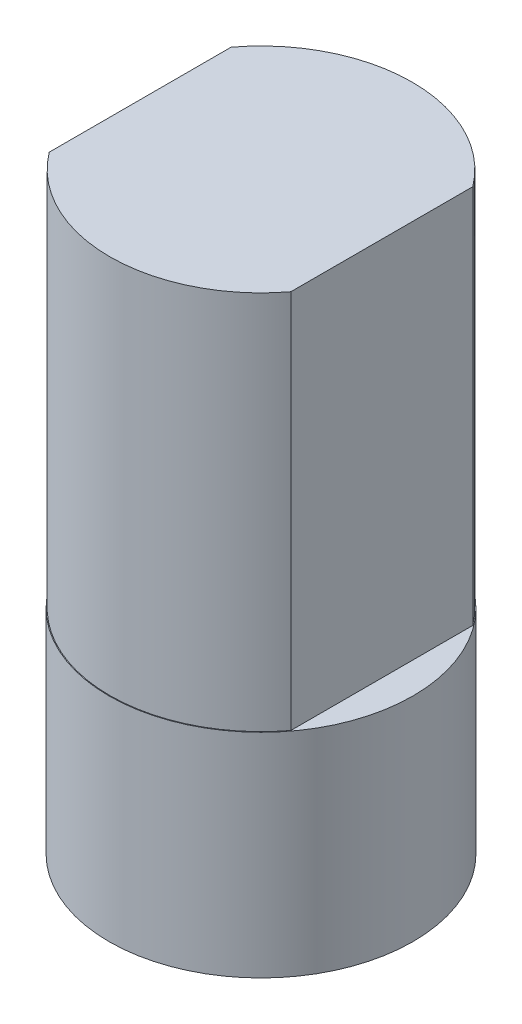
ISO-10303-21;
HEADER;
FILE_DESCRIPTION(('STEP AP214'),'2;1');
FILE_NAME('part.step','',(''),(''),'','','');
FILE_SCHEMA(('AUTOMOTIVE_DESIGN { 1 0 10303 214 1 1 1 1 }'));
ENDSEC;
DATA;
#1=APPLICATION_CONTEXT('core data for automotive mechanical design processes');
#2=APPLICATION_PROTOCOL_DEFINITION('international standard','automotive_design',2000,#1);
#3=PRODUCT_CONTEXT('',#1,'mechanical');
#4=PRODUCT('Part','Part','',(#3));
#5=PRODUCT_RELATED_PRODUCT_CATEGORY('part','',(#4));
#6=PRODUCT_DEFINITION_FORMATION('','',#4);
#7=PRODUCT_DEFINITION_CONTEXT('part definition',#1,'design');
#8=PRODUCT_DEFINITION('design','',#6,#7);
#9=PRODUCT_DEFINITION_SHAPE('','',#8);
#10=(LENGTH_UNIT() NAMED_UNIT(*) SI_UNIT(.MILLI.,.METRE.));
#11=(NAMED_UNIT(*) PLANE_ANGLE_UNIT() SI_UNIT($,.RADIAN.));
#12=(NAMED_UNIT(*) SI_UNIT($,.STERADIAN.) SOLID_ANGLE_UNIT());
#13=UNCERTAINTY_MEASURE_WITH_UNIT(LENGTH_MEASURE(1.E-05),#10,'distance_accuracy_value','');
#14=(GEOMETRIC_REPRESENTATION_CONTEXT(3) GLOBAL_UNCERTAINTY_ASSIGNED_CONTEXT((#13)) GLOBAL_UNIT_ASSIGNED_CONTEXT((#10,
#11,#12)) REPRESENTATION_CONTEXT('',''));
#15=CARTESIAN_POINT('',(0.,0.,0.));
#16=DIRECTION('',(0.,0.,1.));
#17=DIRECTION('',(1.,0.,0.));
#18=AXIS2_PLACEMENT_3D('',#15,#16,#17);
#19=CARTESIAN_POINT('',(0.,7.,0.));
#20=DIRECTION('',(0.,-1.,0.));
#21=DIRECTION('',(0.,0.,-1.));
#22=AXIS2_PLACEMENT_3D('',#19,#20,#21);
#23=CYLINDRICAL_SURFACE('',#22,5.);
#24=CARTESIAN_POINT('',(0.,7.,0.));
#25=DIRECTION('',(0.,1.,0.));
#26=DIRECTION('',(0.,0.,1.));
#27=AXIS2_PLACEMENT_3D('',#24,#25,#26);
#28=CIRCLE('',#27,5.);
#29=CARTESIAN_POINT('',(0.,7.,5.));
#30=VERTEX_POINT('',#29);
#31=EDGE_CURVE('E11',#30,#30,#28,.T.);
#32=ORIENTED_EDGE('',*,*,#31,.F.);
#33=EDGE_LOOP('',(#32));
#34=FACE_BOUND('',#33,.T.);
#35=CARTESIAN_POINT('',(0.,0.,0.));
#36=DIRECTION('',(0.,1.,0.));
#37=DIRECTION('',(0.,0.,1.));
#38=AXIS2_PLACEMENT_3D('',#35,#36,#37);
#39=CIRCLE('',#38,5.);
#40=CARTESIAN_POINT('',(0.,0.,5.));
#41=VERTEX_POINT('',#40);
#42=EDGE_CURVE('E42',#41,#41,#39,.T.);
#43=ORIENTED_EDGE('',*,*,#42,.T.);
#44=EDGE_LOOP('',(#43));
#45=FACE_BOUND('',#44,.T.);
#46=ADVANCED_FACE('F39',(#34,#45),#23,.T.);
#47=CARTESIAN_POINT('',(0.,7.,0.));
#48=DIRECTION('',(0.,1.,0.));
#49=DIRECTION('',(0.,0.,1.));
#50=AXIS2_PLACEMENT_3D('',#47,#48,#49);
#51=PLANE('',#50);
#52=CARTESIAN_POINT('',(0.,7.,0.));
#53=DIRECTION('',(0.,1.,0.));
#54=DIRECTION('',(0.,0.,1.));
#55=AXIS2_PLACEMENT_3D('',#52,#53,#54);
#56=CIRCLE('',#55,4.975);
#57=CARTESIAN_POINT('',(3.975,7.,-2.99165506033032));
#58=VERTEX_POINT('',#57);
#59=CARTESIAN_POINT('',(-3.975,7.,-2.99165506033032));
#60=VERTEX_POINT('',#59);
#61=EDGE_CURVE('E54',#58,#60,#56,.T.);
#62=ORIENTED_EDGE('',*,*,#61,.F.);
#63=DIRECTION('',(0.,0.,-1.));
#64=VECTOR('',#63,1.);
#65=CARTESIAN_POINT('',(3.975,7.,-2.99165506033032));
#66=LINE('',#65,#64);
#67=CARTESIAN_POINT('',(3.975,7.,2.99165506033032));
#68=VERTEX_POINT('',#67);
#69=EDGE_CURVE('E58',#68,#58,#66,.T.);
#70=ORIENTED_EDGE('',*,*,#69,.F.);
#71=CARTESIAN_POINT('',(0.,7.,0.));
#72=DIRECTION('',(0.,1.,0.));
#73=DIRECTION('',(0.,0.,1.));
#74=AXIS2_PLACEMENT_3D('',#71,#72,#73);
#75=CIRCLE('',#74,4.975);
#76=CARTESIAN_POINT('',(-3.975,7.,2.99165506033032));
#77=VERTEX_POINT('',#76);
#78=EDGE_CURVE('E118',#77,#68,#75,.T.);
#79=ORIENTED_EDGE('',*,*,#78,.F.);
#80=DIRECTION('',(0.,0.,1.));
#81=VECTOR('',#80,1.);
#82=CARTESIAN_POINT('',(-3.975,7.,-2.99165506033032));
#83=LINE('',#82,#81);
#84=EDGE_CURVE('E121',#60,#77,#83,.T.);
#85=ORIENTED_EDGE('',*,*,#84,.F.);
#86=EDGE_LOOP('',(#62,#70,#79,#85));
#87=FACE_BOUND('',#86,.T.);
#88=ORIENTED_EDGE('',*,*,#31,.T.);
#89=EDGE_LOOP('',(#88));
#90=FACE_BOUND('',#89,.T.);
#91=ADVANCED_FACE('F143',(#87,#90),#51,.T.);
#92=CARTESIAN_POINT('',(0.,0.,0.));
#93=DIRECTION('',(0.,1.,0.));
#94=DIRECTION('',(0.,0.,1.));
#95=AXIS2_PLACEMENT_3D('',#92,#93,#94);
#96=PLANE('',#95);
#97=ORIENTED_EDGE('',*,*,#42,.F.);
#98=EDGE_LOOP('',(#97));
#99=FACE_BOUND('',#98,.T.);
#100=ADVANCED_FACE('F148',(#99),#96,.F.);
#101=CARTESIAN_POINT('',(0.,19.5,0.));
#102=DIRECTION('',(0.,-1.,0.));
#103=DIRECTION('',(0.,0.,-1.));
#104=AXIS2_PLACEMENT_3D('',#101,#102,#103);
#105=CYLINDRICAL_SURFACE('',#104,4.975);
#106=ORIENTED_EDGE('',*,*,#61,.T.);
#107=DIRECTION('',(0.,-1.,0.));
#108=VECTOR('',#107,1.);
#109=CARTESIAN_POINT('',(-3.975,19.5,-2.99165506033032));
#110=LINE('',#109,#108);
#111=CARTESIAN_POINT('',(-3.975,19.5,-2.99165506033032));
#112=VERTEX_POINT('',#111);
#113=EDGE_CURVE('E83',#112,#60,#110,.T.);
#114=ORIENTED_EDGE('',*,*,#113,.F.);
#115=CARTESIAN_POINT('',(0.,19.5,0.));
#116=DIRECTION('',(0.,1.,0.));
#117=DIRECTION('',(0.,0.,1.));
#118=AXIS2_PLACEMENT_3D('',#115,#116,#117);
#119=CIRCLE('',#118,4.975);
#120=CARTESIAN_POINT('',(3.975,19.5,-2.99165506033032));
#121=VERTEX_POINT('',#120);
#122=EDGE_CURVE('E90',#121,#112,#119,.T.);
#123=ORIENTED_EDGE('',*,*,#122,.F.);
#124=DIRECTION('',(0.,-1.,0.));
#125=VECTOR('',#124,1.);
#126=CARTESIAN_POINT('',(3.975,19.5,-2.99165506033032));
#127=LINE('',#126,#125);
#128=EDGE_CURVE('E113',#121,#58,#127,.T.);
#129=ORIENTED_EDGE('',*,*,#128,.T.);
#130=EDGE_LOOP('',(#106,#114,#123,#129));
#131=FACE_BOUND('',#130,.T.);
#132=ADVANCED_FACE('F101',(#131),#105,.T.);
#133=CARTESIAN_POINT('',(-3.975,19.5,-2.99165506033032));
#134=DIRECTION('',(1.,0.,0.));
#135=DIRECTION('',(0.,0.,-1.));
#136=AXIS2_PLACEMENT_3D('',#133,#134,#135);
#137=PLANE('',#136);
#138=ORIENTED_EDGE('',*,*,#84,.T.);
#139=DIRECTION('',(0.,-1.,0.));
#140=VECTOR('',#139,1.);
#141=CARTESIAN_POINT('',(-3.975,19.5,2.99165506033032));
#142=LINE('',#141,#140);
#143=CARTESIAN_POINT('',(-3.975,19.5,2.99165506033032));
#144=VERTEX_POINT('',#143);
#145=EDGE_CURVE('E85',#144,#77,#142,.T.);
#146=ORIENTED_EDGE('',*,*,#145,.F.);
#147=DIRECTION('',(0.,0.,1.));
#148=VECTOR('',#147,1.);
#149=CARTESIAN_POINT('',(-3.975,19.5,-2.99165506033032));
#150=LINE('',#149,#148);
#151=EDGE_CURVE('E78',#112,#144,#150,.T.);
#152=ORIENTED_EDGE('',*,*,#151,.F.);
#153=ORIENTED_EDGE('',*,*,#113,.T.);
#154=EDGE_LOOP('',(#138,#146,#152,#153));
#155=FACE_BOUND('',#154,.T.);
#156=ADVANCED_FACE('F81',(#155),#137,.F.);
#157=CARTESIAN_POINT('',(0.,19.5,0.));
#158=DIRECTION('',(0.,-1.,0.));
#159=DIRECTION('',(0.,0.,-1.));
#160=AXIS2_PLACEMENT_3D('',#157,#158,#159);
#161=CYLINDRICAL_SURFACE('',#160,4.975);
#162=ORIENTED_EDGE('',*,*,#78,.T.);
#163=DIRECTION('',(0.,-1.,0.));
#164=VECTOR('',#163,1.);
#165=CARTESIAN_POINT('',(3.975,19.5,2.99165506033032));
#166=LINE('',#165,#164);
#167=CARTESIAN_POINT('',(3.975,19.5,2.99165506033032));
#168=VERTEX_POINT('',#167);
#169=EDGE_CURVE('E107',#168,#68,#166,.T.);
#170=ORIENTED_EDGE('',*,*,#169,.F.);
#171=CARTESIAN_POINT('',(0.,19.5,0.));
#172=DIRECTION('',(0.,1.,0.));
#173=DIRECTION('',(0.,0.,1.));
#174=AXIS2_PLACEMENT_3D('',#171,#172,#173);
#175=CIRCLE('',#174,4.975);
#176=EDGE_CURVE('E89',#144,#168,#175,.T.);
#177=ORIENTED_EDGE('',*,*,#176,.F.);
#178=ORIENTED_EDGE('',*,*,#145,.T.);
#179=EDGE_LOOP('',(#162,#170,#177,#178));
#180=FACE_BOUND('',#179,.T.);
#181=ADVANCED_FACE('F131',(#180),#161,.T.);
#182=CARTESIAN_POINT('',(3.975,19.5,-2.99165506033032));
#183=DIRECTION('',(-1.,0.,0.));
#184=DIRECTION('',(0.,0.,1.));
#185=AXIS2_PLACEMENT_3D('',#182,#183,#184);
#186=PLANE('',#185);
#187=ORIENTED_EDGE('',*,*,#69,.T.);
#188=ORIENTED_EDGE('',*,*,#128,.F.);
#189=DIRECTION('',(0.,0.,-1.));
#190=VECTOR('',#189,1.);
#191=CARTESIAN_POINT('',(3.975,19.5,-2.99165506033032));
#192=LINE('',#191,#190);
#193=EDGE_CURVE('E95',#168,#121,#192,.T.);
#194=ORIENTED_EDGE('',*,*,#193,.F.);
#195=ORIENTED_EDGE('',*,*,#169,.T.);
#196=EDGE_LOOP('',(#187,#188,#194,#195));
#197=FACE_BOUND('',#196,.T.);
#198=ADVANCED_FACE('F133',(#197),#186,.F.);
#199=CARTESIAN_POINT('',(0.,19.5,0.));
#200=DIRECTION('',(0.,1.,0.));
#201=DIRECTION('',(0.,0.,1.));
#202=AXIS2_PLACEMENT_3D('',#199,#200,#201);
#203=PLANE('',#202);
#204=ORIENTED_EDGE('',*,*,#122,.T.);
#205=ORIENTED_EDGE('',*,*,#151,.T.);
#206=ORIENTED_EDGE('',*,*,#176,.T.);
#207=ORIENTED_EDGE('',*,*,#193,.T.);
#208=EDGE_LOOP('',(#204,#205,#206,#207));
#209=FACE_BOUND('',#208,.T.);
#210=ADVANCED_FACE('F93',(#209),#203,.T.);
#211=CLOSED_SHELL('',(#46,#91,#100,#132,#156,#181,#198,#210));
#212=MANIFOLD_SOLID_BREP('B2',#211);
#213=ADVANCED_BREP_SHAPE_REPRESENTATION('',(#18,#212),#14);
#214=SHAPE_DEFINITION_REPRESENTATION(#9,#213);
ENDSEC;
END-ISO-10303-21;
